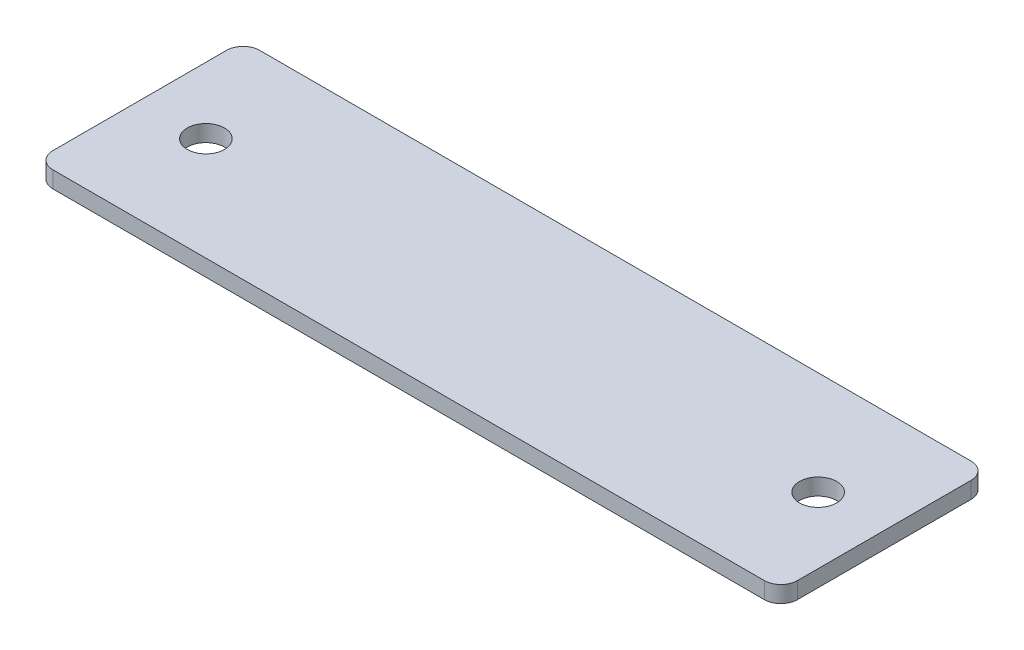
ISO-10303-21;
HEADER;
FILE_DESCRIPTION(('STEP AP214'),'2;1');
FILE_NAME('part.step','',(''),(''),'','','');
FILE_SCHEMA(('AUTOMOTIVE_DESIGN { 1 0 10303 214 1 1 1 1 }'));
ENDSEC;
DATA;
#1=APPLICATION_CONTEXT('core data for automotive mechanical design processes');
#2=APPLICATION_PROTOCOL_DEFINITION('international standard','automotive_design',2000,#1);
#3=PRODUCT_CONTEXT('',#1,'mechanical');
#4=PRODUCT('Part','Part','',(#3));
#5=PRODUCT_RELATED_PRODUCT_CATEGORY('part','',(#4));
#6=PRODUCT_DEFINITION_FORMATION('','',#4);
#7=PRODUCT_DEFINITION_CONTEXT('part definition',#1,'design');
#8=PRODUCT_DEFINITION('design','',#6,#7);
#9=PRODUCT_DEFINITION_SHAPE('','',#8);
#10=(LENGTH_UNIT() NAMED_UNIT(*) SI_UNIT(.MILLI.,.METRE.));
#11=(NAMED_UNIT(*) PLANE_ANGLE_UNIT() SI_UNIT($,.RADIAN.));
#12=(NAMED_UNIT(*) SI_UNIT($,.STERADIAN.) SOLID_ANGLE_UNIT());
#13=UNCERTAINTY_MEASURE_WITH_UNIT(LENGTH_MEASURE(1.E-05),#10,'distance_accuracy_value','');
#14=(GEOMETRIC_REPRESENTATION_CONTEXT(3) GLOBAL_UNCERTAINTY_ASSIGNED_CONTEXT((#13)) GLOBAL_UNIT_ASSIGNED_CONTEXT((#10,
#11,#12)) REPRESENTATION_CONTEXT('',''));
#15=CARTESIAN_POINT('',(0.,0.,0.));
#16=DIRECTION('',(0.,0.,1.));
#17=DIRECTION('',(1.,0.,0.));
#18=AXIS2_PLACEMENT_3D('',#15,#16,#17);
#19=CARTESIAN_POINT('',(0.,-2.,25.));
#20=DIRECTION('',(0.,1.,0.));
#21=DIRECTION('',(0.,0.,1.));
#22=AXIS2_PLACEMENT_3D('',#19,#20,#21);
#23=PLANE('',#22);
#24=CARTESIAN_POINT('',(8.,-2.,12.5));
#25=DIRECTION('',(0.,1.,0.));
#26=DIRECTION('',(0.,0.,1.));
#27=AXIS2_PLACEMENT_3D('',#24,#25,#26);
#28=CIRCLE('',#27,2.25);
#29=CARTESIAN_POINT('',(8.,-2.,14.75));
#30=VERTEX_POINT('',#29);
#31=EDGE_CURVE('E174',#30,#30,#28,.T.);
#32=ORIENTED_EDGE('',*,*,#31,.T.);
#33=EDGE_LOOP('',(#32));
#34=FACE_BOUND('',#33,.T.);
#35=CARTESIAN_POINT('',(82.,-2.,12.5));
#36=DIRECTION('',(0.,1.,0.));
#37=DIRECTION('',(0.,0.,1.));
#38=AXIS2_PLACEMENT_3D('',#35,#36,#37);
#39=CIRCLE('',#38,2.25);
#40=CARTESIAN_POINT('',(82.,-2.,14.75));
#41=VERTEX_POINT('',#40);
#42=EDGE_CURVE('E166',#41,#41,#39,.T.);
#43=ORIENTED_EDGE('',*,*,#42,.T.);
#44=EDGE_LOOP('',(#43));
#45=FACE_BOUND('',#44,.T.);
#46=DIRECTION('',(1.,0.,0.));
#47=VECTOR('',#46,1.);
#48=CARTESIAN_POINT('',(0.,-2.,25.));
#49=LINE('',#48,#47);
#50=CARTESIAN_POINT('',(2.,-2.,25.));
#51=VERTEX_POINT('',#50);
#52=CARTESIAN_POINT('',(88.,-2.,25.));
#53=VERTEX_POINT('',#52);
#54=EDGE_CURVE('E163',#51,#53,#49,.T.);
#55=ORIENTED_EDGE('',*,*,#54,.F.);
#56=CARTESIAN_POINT('',(2.,-2.,23.));
#57=DIRECTION('',(0.,1.,0.));
#58=DIRECTION('',(0.,0.,1.));
#59=AXIS2_PLACEMENT_3D('',#56,#57,#58);
#60=CIRCLE('',#59,2.);
#61=CARTESIAN_POINT('',(0.,-2.,23.));
#62=VERTEX_POINT('',#61);
#63=EDGE_CURVE('E11',#51,#62,#60,.F.);
#64=ORIENTED_EDGE('',*,*,#63,.T.);
#65=DIRECTION('',(0.,0.,-1.));
#66=VECTOR('',#65,1.);
#67=CARTESIAN_POINT('',(0.,-2.,25.));
#68=LINE('',#67,#66);
#69=CARTESIAN_POINT('',(0.,-2.,2.));
#70=VERTEX_POINT('',#69);
#71=EDGE_CURVE('E153',#62,#70,#68,.T.);
#72=ORIENTED_EDGE('',*,*,#71,.T.);
#73=CARTESIAN_POINT('',(2.,-2.,2.));
#74=DIRECTION('',(0.,1.,0.));
#75=DIRECTION('',(0.,0.,1.));
#76=AXIS2_PLACEMENT_3D('',#73,#74,#75);
#77=CIRCLE('',#76,2.);
#78=CARTESIAN_POINT('',(2.,-2.,0.));
#79=VERTEX_POINT('',#78);
#80=EDGE_CURVE('E144',#70,#79,#77,.F.);
#81=ORIENTED_EDGE('',*,*,#80,.T.);
#82=DIRECTION('',(1.,0.,0.));
#83=VECTOR('',#82,1.);
#84=CARTESIAN_POINT('',(0.,-2.,0.));
#85=LINE('',#84,#83);
#86=CARTESIAN_POINT('',(88.,-2.,0.));
#87=VERTEX_POINT('',#86);
#88=EDGE_CURVE('E164',#79,#87,#85,.T.);
#89=ORIENTED_EDGE('',*,*,#88,.T.);
#90=CARTESIAN_POINT('',(88.,-2.,2.));
#91=DIRECTION('',(0.,1.,0.));
#92=DIRECTION('',(0.,0.,1.));
#93=AXIS2_PLACEMENT_3D('',#90,#91,#92);
#94=CIRCLE('',#93,2.);
#95=CARTESIAN_POINT('',(90.,-2.,2.));
#96=VERTEX_POINT('',#95);
#97=EDGE_CURVE('E130',#87,#96,#94,.F.);
#98=ORIENTED_EDGE('',*,*,#97,.T.);
#99=DIRECTION('',(0.,0.,-1.));
#100=VECTOR('',#99,1.);
#101=CARTESIAN_POINT('',(90.,-2.,25.));
#102=LINE('',#101,#100);
#103=CARTESIAN_POINT('',(90.,-2.,23.));
#104=VERTEX_POINT('',#103);
#105=EDGE_CURVE('E117',#104,#96,#102,.T.);
#106=ORIENTED_EDGE('',*,*,#105,.F.);
#107=CARTESIAN_POINT('',(88.,-2.,23.));
#108=DIRECTION('',(0.,1.,0.));
#109=DIRECTION('',(0.,0.,1.));
#110=AXIS2_PLACEMENT_3D('',#107,#108,#109);
#111=CIRCLE('',#110,2.);
#112=EDGE_CURVE('E122',#104,#53,#111,.F.);
#113=ORIENTED_EDGE('',*,*,#112,.T.);
#114=EDGE_LOOP('',(#55,#64,#72,#81,#89,#98,#106,#113));
#115=FACE_BOUND('',#114,.T.);
#116=ADVANCED_FACE('F33',(#34,#45,#115),#23,.F.);
#117=CARTESIAN_POINT('',(90.,0.,25.));
#118=DIRECTION('',(1.,0.,0.));
#119=DIRECTION('',(0.,0.,-1.));
#120=AXIS2_PLACEMENT_3D('',#117,#118,#119);
#121=PLANE('',#120);
#122=ORIENTED_EDGE('',*,*,#105,.T.);
#123=DIRECTION('',(0.,-1.,0.));
#124=VECTOR('',#123,1.);
#125=CARTESIAN_POINT('',(90.,0.,2.));
#126=LINE('',#125,#124);
#127=CARTESIAN_POINT('',(90.,0.,2.));
#128=VERTEX_POINT('',#127);
#129=EDGE_CURVE('E116',#96,#128,#126,.F.);
#130=ORIENTED_EDGE('',*,*,#129,.T.);
#131=DIRECTION('',(0.,0.,-1.));
#132=VECTOR('',#131,1.);
#133=CARTESIAN_POINT('',(90.,0.,25.));
#134=LINE('',#133,#132);
#135=CARTESIAN_POINT('',(90.,0.,23.));
#136=VERTEX_POINT('',#135);
#137=EDGE_CURVE('E99',#136,#128,#134,.T.);
#138=ORIENTED_EDGE('',*,*,#137,.F.);
#139=DIRECTION('',(0.,-1.,0.));
#140=VECTOR('',#139,1.);
#141=CARTESIAN_POINT('',(90.,-2.,23.));
#142=LINE('',#141,#140);
#143=EDGE_CURVE('E113',#136,#104,#142,.T.);
#144=ORIENTED_EDGE('',*,*,#143,.T.);
#145=EDGE_LOOP('',(#122,#130,#138,#144));
#146=FACE_BOUND('',#145,.T.);
#147=ADVANCED_FACE('F112',(#146),#121,.T.);
#148=CARTESIAN_POINT('',(0.,0.,25.));
#149=DIRECTION('',(0.,1.,0.));
#150=DIRECTION('',(0.,0.,1.));
#151=AXIS2_PLACEMENT_3D('',#148,#149,#150);
#152=PLANE('',#151);
#153=CARTESIAN_POINT('',(8.,0.,12.5));
#154=DIRECTION('',(0.,1.,0.));
#155=DIRECTION('',(0.,0.,1.));
#156=AXIS2_PLACEMENT_3D('',#153,#154,#155);
#157=CIRCLE('',#156,2.25);
#158=CARTESIAN_POINT('',(8.,0.,14.75));
#159=VERTEX_POINT('',#158);
#160=EDGE_CURVE('E177',#159,#159,#157,.T.);
#161=ORIENTED_EDGE('',*,*,#160,.F.);
#162=EDGE_LOOP('',(#161));
#163=FACE_BOUND('',#162,.T.);
#164=CARTESIAN_POINT('',(82.,0.,12.5));
#165=DIRECTION('',(0.,1.,0.));
#166=DIRECTION('',(0.,0.,1.));
#167=AXIS2_PLACEMENT_3D('',#164,#165,#166);
#168=CIRCLE('',#167,2.25);
#169=CARTESIAN_POINT('',(82.,0.,14.75));
#170=VERTEX_POINT('',#169);
#171=EDGE_CURVE('E171',#170,#170,#168,.T.);
#172=ORIENTED_EDGE('',*,*,#171,.F.);
#173=EDGE_LOOP('',(#172));
#174=FACE_BOUND('',#173,.T.);
#175=DIRECTION('',(0.,0.,-1.));
#176=VECTOR('',#175,1.);
#177=CARTESIAN_POINT('',(0.,0.,25.));
#178=LINE('',#177,#176);
#179=CARTESIAN_POINT('',(0.,0.,23.));
#180=VERTEX_POINT('',#179);
#181=CARTESIAN_POINT('',(0.,0.,2.));
#182=VERTEX_POINT('',#181);
#183=EDGE_CURVE('E118',#180,#182,#178,.T.);
#184=ORIENTED_EDGE('',*,*,#183,.F.);
#185=CARTESIAN_POINT('',(2.,0.,23.));
#186=DIRECTION('',(0.,1.,0.));
#187=DIRECTION('',(0.,0.,1.));
#188=AXIS2_PLACEMENT_3D('',#185,#186,#187);
#189=CIRCLE('',#188,2.);
#190=CARTESIAN_POINT('',(2.,0.,25.));
#191=VERTEX_POINT('',#190);
#192=EDGE_CURVE('E55',#180,#191,#189,.T.);
#193=ORIENTED_EDGE('',*,*,#192,.T.);
#194=DIRECTION('',(1.,0.,0.));
#195=VECTOR('',#194,1.);
#196=CARTESIAN_POINT('',(0.,0.,25.));
#197=LINE('',#196,#195);
#198=CARTESIAN_POINT('',(88.,0.,25.));
#199=VERTEX_POINT('',#198);
#200=EDGE_CURVE('E101',#191,#199,#197,.T.);
#201=ORIENTED_EDGE('',*,*,#200,.T.);
#202=CARTESIAN_POINT('',(88.,0.,23.));
#203=DIRECTION('',(0.,1.,0.));
#204=DIRECTION('',(0.,0.,1.));
#205=AXIS2_PLACEMENT_3D('',#202,#203,#204);
#206=CIRCLE('',#205,2.);
#207=EDGE_CURVE('E95',#199,#136,#206,.T.);
#208=ORIENTED_EDGE('',*,*,#207,.T.);
#209=ORIENTED_EDGE('',*,*,#137,.T.);
#210=CARTESIAN_POINT('',(88.,0.,2.));
#211=DIRECTION('',(0.,1.,0.));
#212=DIRECTION('',(0.,0.,1.));
#213=AXIS2_PLACEMENT_3D('',#210,#211,#212);
#214=CIRCLE('',#213,2.);
#215=CARTESIAN_POINT('',(88.,0.,0.));
#216=VERTEX_POINT('',#215);
#217=EDGE_CURVE('E133',#128,#216,#214,.T.);
#218=ORIENTED_EDGE('',*,*,#217,.T.);
#219=DIRECTION('',(1.,0.,0.));
#220=VECTOR('',#219,1.);
#221=CARTESIAN_POINT('',(0.,0.,0.));
#222=LINE('',#221,#220);
#223=CARTESIAN_POINT('',(2.,0.,0.));
#224=VERTEX_POINT('',#223);
#225=EDGE_CURVE('E161',#224,#216,#222,.T.);
#226=ORIENTED_EDGE('',*,*,#225,.F.);
#227=CARTESIAN_POINT('',(2.,0.,2.));
#228=DIRECTION('',(0.,1.,0.));
#229=DIRECTION('',(0.,0.,1.));
#230=AXIS2_PLACEMENT_3D('',#227,#228,#229);
#231=CIRCLE('',#230,2.);
#232=EDGE_CURVE('E138',#224,#182,#231,.T.);
#233=ORIENTED_EDGE('',*,*,#232,.T.);
#234=EDGE_LOOP('',(#184,#193,#201,#208,#209,#218,#226,#233));
#235=FACE_BOUND('',#234,.T.);
#236=ADVANCED_FACE('F97',(#163,#174,#235),#152,.T.);
#237=CARTESIAN_POINT('',(0.,-2.,25.));
#238=DIRECTION('',(-1.,0.,0.));
#239=DIRECTION('',(0.,0.,1.));
#240=AXIS2_PLACEMENT_3D('',#237,#238,#239);
#241=PLANE('',#240);
#242=ORIENTED_EDGE('',*,*,#71,.F.);
#243=DIRECTION('',(0.,1.,0.));
#244=VECTOR('',#243,1.);
#245=CARTESIAN_POINT('',(0.,0.,23.));
#246=LINE('',#245,#244);
#247=EDGE_CURVE('E146',#62,#180,#246,.T.);
#248=ORIENTED_EDGE('',*,*,#247,.T.);
#249=ORIENTED_EDGE('',*,*,#183,.T.);
#250=DIRECTION('',(0.,1.,0.));
#251=VECTOR('',#250,1.);
#252=CARTESIAN_POINT('',(0.,-2.,2.));
#253=LINE('',#252,#251);
#254=EDGE_CURVE('E141',#182,#70,#253,.F.);
#255=ORIENTED_EDGE('',*,*,#254,.T.);
#256=EDGE_LOOP('',(#242,#248,#249,#255));
#257=FACE_BOUND('',#256,.T.);
#258=ADVANCED_FACE('F152',(#257),#241,.T.);
#259=CARTESIAN_POINT('',(0.,0.,25.));
#260=DIRECTION('',(0.,0.,-1.));
#261=DIRECTION('',(-1.,0.,0.));
#262=AXIS2_PLACEMENT_3D('',#259,#260,#261);
#263=PLANE('',#262);
#264=ORIENTED_EDGE('',*,*,#200,.F.);
#265=DIRECTION('',(0.,1.,0.));
#266=VECTOR('',#265,1.);
#267=CARTESIAN_POINT('',(2.,-2.,25.));
#268=LINE('',#267,#266);
#269=EDGE_CURVE('E41',#191,#51,#268,.F.);
#270=ORIENTED_EDGE('',*,*,#269,.T.);
#271=ORIENTED_EDGE('',*,*,#54,.T.);
#272=DIRECTION('',(0.,-1.,0.));
#273=VECTOR('',#272,1.);
#274=CARTESIAN_POINT('',(88.,0.,25.));
#275=LINE('',#274,#273);
#276=EDGE_CURVE('E107',#53,#199,#275,.F.);
#277=ORIENTED_EDGE('',*,*,#276,.T.);
#278=EDGE_LOOP('',(#264,#270,#271,#277));
#279=FACE_BOUND('',#278,.T.);
#280=ADVANCED_FACE('F220',(#279),#263,.F.);
#281=CARTESIAN_POINT('',(0.,0.,0.));
#282=DIRECTION('',(0.,0.,-1.));
#283=DIRECTION('',(-1.,0.,0.));
#284=AXIS2_PLACEMENT_3D('',#281,#282,#283);
#285=PLANE('',#284);
#286=ORIENTED_EDGE('',*,*,#88,.F.);
#287=DIRECTION('',(0.,1.,0.));
#288=VECTOR('',#287,1.);
#289=CARTESIAN_POINT('',(2.,0.,0.));
#290=LINE('',#289,#288);
#291=EDGE_CURVE('E135',#79,#224,#290,.T.);
#292=ORIENTED_EDGE('',*,*,#291,.T.);
#293=ORIENTED_EDGE('',*,*,#225,.T.);
#294=DIRECTION('',(0.,-1.,0.));
#295=VECTOR('',#294,1.);
#296=CARTESIAN_POINT('',(88.,0.,0.));
#297=LINE('',#296,#295);
#298=EDGE_CURVE('E106',#216,#87,#297,.T.);
#299=ORIENTED_EDGE('',*,*,#298,.T.);
#300=EDGE_LOOP('',(#286,#292,#293,#299));
#301=FACE_BOUND('',#300,.T.);
#302=ADVANCED_FACE('F214',(#301),#285,.T.);
#303=CARTESIAN_POINT('',(88.,0.,23.));
#304=DIRECTION('',(0.,1.,0.));
#305=DIRECTION('',(0.,0.,1.));
#306=AXIS2_PLACEMENT_3D('',#303,#304,#305);
#307=CYLINDRICAL_SURFACE('',#306,2.);
#308=ORIENTED_EDGE('',*,*,#207,.F.);
#309=ORIENTED_EDGE('',*,*,#276,.F.);
#310=ORIENTED_EDGE('',*,*,#112,.F.);
#311=ORIENTED_EDGE('',*,*,#143,.F.);
#312=EDGE_LOOP('',(#308,#309,#310,#311));
#313=FACE_BOUND('',#312,.T.);
#314=ADVANCED_FACE('F120',(#313),#307,.T.);
#315=CARTESIAN_POINT('',(88.,0.,2.));
#316=DIRECTION('',(0.,-1.,0.));
#317=DIRECTION('',(0.,0.,-1.));
#318=AXIS2_PLACEMENT_3D('',#315,#316,#317);
#319=CYLINDRICAL_SURFACE('',#318,2.);
#320=ORIENTED_EDGE('',*,*,#217,.F.);
#321=ORIENTED_EDGE('',*,*,#129,.F.);
#322=ORIENTED_EDGE('',*,*,#97,.F.);
#323=ORIENTED_EDGE('',*,*,#298,.F.);
#324=EDGE_LOOP('',(#320,#321,#322,#323));
#325=FACE_BOUND('',#324,.T.);
#326=ADVANCED_FACE('F204',(#325),#319,.T.);
#327=CARTESIAN_POINT('',(2.,0.,2.));
#328=DIRECTION('',(0.,1.,0.));
#329=DIRECTION('',(0.,0.,1.));
#330=AXIS2_PLACEMENT_3D('',#327,#328,#329);
#331=CYLINDRICAL_SURFACE('',#330,2.);
#332=ORIENTED_EDGE('',*,*,#80,.F.);
#333=ORIENTED_EDGE('',*,*,#254,.F.);
#334=ORIENTED_EDGE('',*,*,#232,.F.);
#335=ORIENTED_EDGE('',*,*,#291,.F.);
#336=EDGE_LOOP('',(#332,#333,#334,#335));
#337=FACE_BOUND('',#336,.T.);
#338=ADVANCED_FACE('F200',(#337),#331,.T.);
#339=CARTESIAN_POINT('',(2.,-2.,23.));
#340=DIRECTION('',(0.,-1.,0.));
#341=DIRECTION('',(0.,0.,-1.));
#342=AXIS2_PLACEMENT_3D('',#339,#340,#341);
#343=CYLINDRICAL_SURFACE('',#342,2.);
#344=ORIENTED_EDGE('',*,*,#63,.F.);
#345=ORIENTED_EDGE('',*,*,#269,.F.);
#346=ORIENTED_EDGE('',*,*,#192,.F.);
#347=ORIENTED_EDGE('',*,*,#247,.F.);
#348=EDGE_LOOP('',(#344,#345,#346,#347));
#349=FACE_BOUND('',#348,.T.);
#350=ADVANCED_FACE('F35',(#349),#343,.T.);
#351=CARTESIAN_POINT('',(82.,-10.,12.5));
#352=DIRECTION('',(0.,1.,0.));
#353=DIRECTION('',(0.,0.,1.));
#354=AXIS2_PLACEMENT_3D('',#351,#352,#353);
#355=CYLINDRICAL_SURFACE('',#354,2.25);
#356=ORIENTED_EDGE('',*,*,#171,.T.);
#357=EDGE_LOOP('',(#356));
#358=FACE_BOUND('',#357,.T.);
#359=ORIENTED_EDGE('',*,*,#42,.F.);
#360=EDGE_LOOP('',(#359));
#361=FACE_BOUND('',#360,.T.);
#362=ADVANCED_FACE('F189',(#358,#361),#355,.F.);
#363=CARTESIAN_POINT('',(8.,-10.,12.5));
#364=DIRECTION('',(0.,1.,0.));
#365=DIRECTION('',(0.,0.,1.));
#366=AXIS2_PLACEMENT_3D('',#363,#364,#365);
#367=CYLINDRICAL_SURFACE('',#366,2.25);
#368=ORIENTED_EDGE('',*,*,#160,.T.);
#369=EDGE_LOOP('',(#368));
#370=FACE_BOUND('',#369,.T.);
#371=ORIENTED_EDGE('',*,*,#31,.F.);
#372=EDGE_LOOP('',(#371));
#373=FACE_BOUND('',#372,.T.);
#374=ADVANCED_FACE('F181',(#370,#373),#367,.F.);
#375=CLOSED_SHELL('',(#116,#147,#236,#258,#280,#302,#314,#326,#338,#350,#362,#374));
#376=MANIFOLD_SOLID_BREP('B2',#375);
#377=ADVANCED_BREP_SHAPE_REPRESENTATION('',(#18,#376),#14);
#378=SHAPE_DEFINITION_REPRESENTATION(#9,#377);
ENDSEC;
END-ISO-10303-21;
